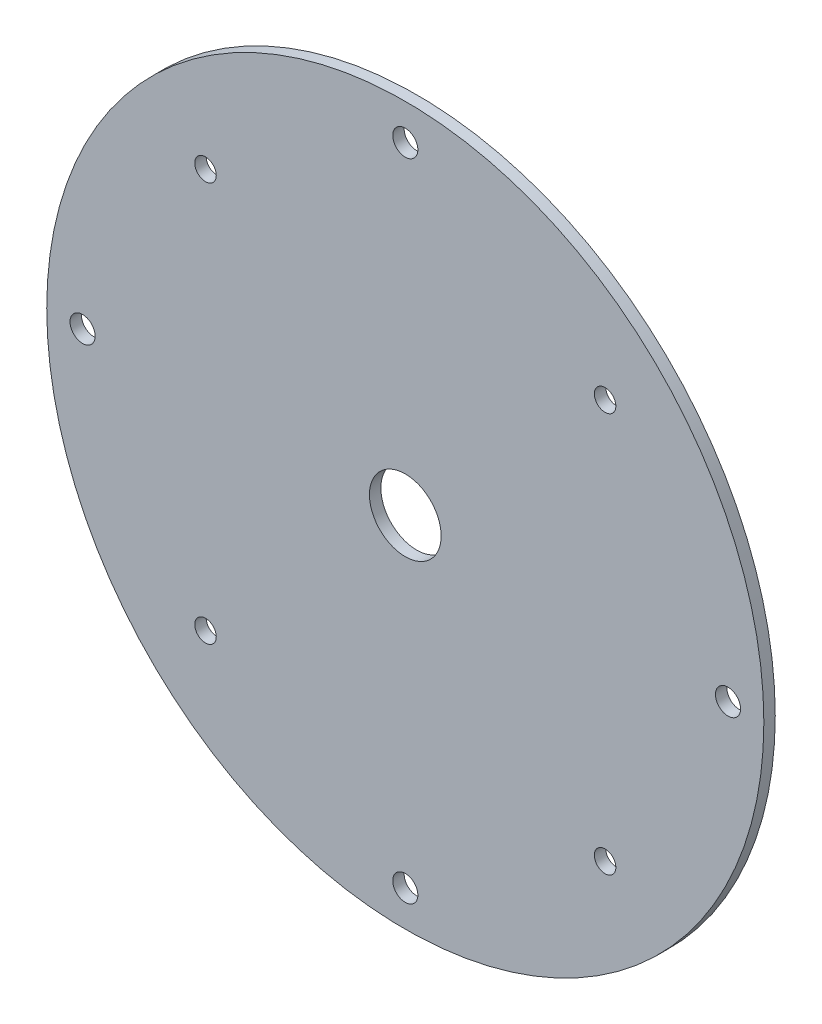
ISO-10303-21;
HEADER;
FILE_DESCRIPTION(('STEP AP214'),'2;1');
FILE_NAME('part.step','',(''),(''),'','','');
FILE_SCHEMA(('AUTOMOTIVE_DESIGN { 1 0 10303 214 1 1 1 1 }'));
ENDSEC;
DATA;
#1=APPLICATION_CONTEXT('core data for automotive mechanical design processes');
#2=APPLICATION_PROTOCOL_DEFINITION('international standard','automotive_design',2000,#1);
#3=PRODUCT_CONTEXT('',#1,'mechanical');
#4=PRODUCT('Part','Part','',(#3));
#5=PRODUCT_RELATED_PRODUCT_CATEGORY('part','',(#4));
#6=PRODUCT_DEFINITION_FORMATION('','',#4);
#7=PRODUCT_DEFINITION_CONTEXT('part definition',#1,'design');
#8=PRODUCT_DEFINITION('design','',#6,#7);
#9=PRODUCT_DEFINITION_SHAPE('','',#8);
#10=(LENGTH_UNIT() NAMED_UNIT(*) SI_UNIT(.MILLI.,.METRE.));
#11=(NAMED_UNIT(*) PLANE_ANGLE_UNIT() SI_UNIT($,.RADIAN.));
#12=(NAMED_UNIT(*) SI_UNIT($,.STERADIAN.) SOLID_ANGLE_UNIT());
#13=UNCERTAINTY_MEASURE_WITH_UNIT(LENGTH_MEASURE(1.E-05),#10,'distance_accuracy_value','');
#14=(GEOMETRIC_REPRESENTATION_CONTEXT(3) GLOBAL_UNCERTAINTY_ASSIGNED_CONTEXT((#13)) GLOBAL_UNIT_ASSIGNED_CONTEXT((#10,
#11,#12)) REPRESENTATION_CONTEXT('',''));
#15=CARTESIAN_POINT('',(0.,0.,0.));
#16=DIRECTION('',(0.,0.,1.));
#17=DIRECTION('',(1.,0.,0.));
#18=AXIS2_PLACEMENT_3D('',#15,#16,#17);
#19=CARTESIAN_POINT('',(0.,0.,1.59));
#20=DIRECTION('',(0.,0.,1.));
#21=DIRECTION('',(1.,0.,0.));
#22=AXIS2_PLACEMENT_3D('',#19,#20,#21);
#23=PLANE('',#22);
#24=CARTESIAN_POINT('',(27.8600143574981,27.8600000000016,1.59));
#25=DIRECTION('',(0.,0.,1.));
#26=DIRECTION('',(1.,0.,0.));
#27=AXIS2_PLACEMENT_3D('',#24,#25,#26);
#28=CIRCLE('',#27,1.5);
#29=CARTESIAN_POINT('',(29.3600143574981,27.8600000000016,1.59));
#30=VERTEX_POINT('',#29);
#31=EDGE_CURVE('E59',#30,#30,#28,.T.);
#32=ORIENTED_EDGE('',*,*,#31,.F.);
#33=EDGE_LOOP('',(#32));
#34=FACE_BOUND('',#33,.T.);
#35=CARTESIAN_POINT('',(27.8600000000016,-27.8600143574965,1.59));
#36=DIRECTION('',(0.,0.,1.));
#37=DIRECTION('',(1.,0.,0.));
#38=AXIS2_PLACEMENT_3D('',#35,#36,#37);
#39=CIRCLE('',#38,1.5);
#40=CARTESIAN_POINT('',(29.3600000000016,-27.8600143574965,1.59));
#41=VERTEX_POINT('',#40);
#42=EDGE_CURVE('E128',#41,#41,#39,.T.);
#43=ORIENTED_EDGE('',*,*,#42,.F.);
#44=EDGE_LOOP('',(#43));
#45=FACE_BOUND('',#44,.T.);
#46=CARTESIAN_POINT('',(-27.8600143574965,-27.86,1.59));
#47=DIRECTION('',(0.,0.,1.));
#48=DIRECTION('',(1.,0.,0.));
#49=AXIS2_PLACEMENT_3D('',#46,#47,#48);
#50=CIRCLE('',#49,1.5);
#51=CARTESIAN_POINT('',(-26.3600143574965,-27.86,1.59));
#52=VERTEX_POINT('',#51);
#53=EDGE_CURVE('E72',#52,#52,#50,.T.);
#54=ORIENTED_EDGE('',*,*,#53,.F.);
#55=EDGE_LOOP('',(#54));
#56=FACE_BOUND('',#55,.T.);
#57=CARTESIAN_POINT('',(-27.86,27.8600143574981,1.59));
#58=DIRECTION('',(0.,0.,1.));
#59=DIRECTION('',(1.,0.,0.));
#60=AXIS2_PLACEMENT_3D('',#57,#58,#59);
#61=CIRCLE('',#60,1.5);
#62=CARTESIAN_POINT('',(-26.36,27.8600143574981,1.59));
#63=VERTEX_POINT('',#62);
#64=EDGE_CURVE('E55',#63,#63,#61,.T.);
#65=ORIENTED_EDGE('',*,*,#64,.F.);
#66=EDGE_LOOP('',(#65));
#67=FACE_BOUND('',#66,.T.);
#68=CARTESIAN_POINT('',(45.0000000000013,1.27346601377202E-12,1.59));
#69=DIRECTION('',(0.,0.,1.));
#70=DIRECTION('',(1.,0.,0.));
#71=AXIS2_PLACEMENT_3D('',#68,#69,#70);
#72=CIRCLE('',#71,1.750000000001);
#73=CARTESIAN_POINT('',(46.7500000000023,1.27346601377202E-12,1.59));
#74=VERTEX_POINT('',#73);
#75=EDGE_CURVE('E78',#74,#74,#72,.T.);
#76=ORIENTED_EDGE('',*,*,#75,.F.);
#77=EDGE_LOOP('',(#76));
#78=FACE_BOUND('',#77,.T.);
#79=CARTESIAN_POINT('',(2.54693202754404E-12,-45.,1.59));
#80=DIRECTION('',(0.,0.,1.));
#81=DIRECTION('',(1.,0.,0.));
#82=AXIS2_PLACEMENT_3D('',#79,#80,#81);
#83=CIRCLE('',#82,1.75000000000274);
#84=CARTESIAN_POINT('',(1.75000000000529,-45.,1.59));
#85=VERTEX_POINT('',#84);
#86=EDGE_CURVE('E84',#85,#85,#83,.T.);
#87=ORIENTED_EDGE('',*,*,#86,.F.);
#88=EDGE_LOOP('',(#87));
#89=FACE_BOUND('',#88,.T.);
#90=CARTESIAN_POINT('',(-44.9999999999987,-1.27897692436818E-12,1.59));
#91=DIRECTION('',(0.,0.,1.));
#92=DIRECTION('',(1.,0.,0.));
#93=AXIS2_PLACEMENT_3D('',#90,#91,#92);
#94=CIRCLE('',#93,1.75000000000205);
#95=CARTESIAN_POINT('',(-43.2499999999967,-1.27897692436818E-12,1.59));
#96=VERTEX_POINT('',#95);
#97=EDGE_CURVE('E54',#96,#96,#94,.T.);
#98=ORIENTED_EDGE('',*,*,#97,.F.);
#99=EDGE_LOOP('',(#98));
#100=FACE_BOUND('',#99,.T.);
#101=CARTESIAN_POINT('',(0.,45.,1.59));
#102=DIRECTION('',(0.,0.,1.));
#103=DIRECTION('',(1.,0.,0.));
#104=AXIS2_PLACEMENT_3D('',#101,#102,#103);
#105=CIRCLE('',#104,1.75);
#106=CARTESIAN_POINT('',(1.75,45.,1.59));
#107=VERTEX_POINT('',#106);
#108=EDGE_CURVE('E77',#107,#107,#105,.T.);
#109=ORIENTED_EDGE('',*,*,#108,.F.);
#110=EDGE_LOOP('',(#109));
#111=FACE_BOUND('',#110,.T.);
#112=CARTESIAN_POINT('',(0.,0.,1.59));
#113=DIRECTION('',(0.,0.,1.));
#114=DIRECTION('',(1.,0.,0.));
#115=AXIS2_PLACEMENT_3D('',#112,#113,#114);
#116=CIRCLE('',#115,50.);
#117=CARTESIAN_POINT('',(-50.,0.,1.59));
#118=VERTEX_POINT('',#117);
#119=EDGE_CURVE('E10',#118,#118,#116,.T.);
#120=ORIENTED_EDGE('',*,*,#119,.T.);
#121=EDGE_LOOP('',(#120));
#122=FACE_BOUND('',#121,.T.);
#123=CARTESIAN_POINT('',(0.,0.,1.59));
#124=DIRECTION('',(0.,0.,1.));
#125=DIRECTION('',(1.,0.,0.));
#126=AXIS2_PLACEMENT_3D('',#123,#124,#125);
#127=CIRCLE('',#126,5.);
#128=CARTESIAN_POINT('',(-5.,0.,1.59));
#129=VERTEX_POINT('',#128);
#130=EDGE_CURVE('E45',#129,#129,#127,.T.);
#131=ORIENTED_EDGE('',*,*,#130,.F.);
#132=EDGE_LOOP('',(#131));
#133=FACE_BOUND('',#132,.T.);
#134=ADVANCED_FACE('F32',(#34,#45,#56,#67,#78,#89,#100,#111,#122,#133),#23,.T.);
#135=CARTESIAN_POINT('',(0.,0.,0.));
#136=DIRECTION('',(0.,0.,1.));
#137=DIRECTION('',(1.,0.,0.));
#138=AXIS2_PLACEMENT_3D('',#135,#136,#137);
#139=PLANE('',#138);
#140=CARTESIAN_POINT('',(27.8600143574981,27.8600000000016,0.));
#141=DIRECTION('',(0.,0.,1.));
#142=DIRECTION('',(1.,0.,0.));
#143=AXIS2_PLACEMENT_3D('',#140,#141,#142);
#144=CIRCLE('',#143,1.5);
#145=CARTESIAN_POINT('',(29.3600143574981,27.8600000000016,0.));
#146=VERTEX_POINT('',#145);
#147=EDGE_CURVE('E36',#146,#146,#144,.T.);
#148=ORIENTED_EDGE('',*,*,#147,.T.);
#149=EDGE_LOOP('',(#148));
#150=FACE_BOUND('',#149,.T.);
#151=CARTESIAN_POINT('',(27.8600000000016,-27.8600143574965,0.));
#152=DIRECTION('',(0.,0.,1.));
#153=DIRECTION('',(1.,0.,0.));
#154=AXIS2_PLACEMENT_3D('',#151,#152,#153);
#155=CIRCLE('',#154,1.5);
#156=CARTESIAN_POINT('',(29.3600000000016,-27.8600143574965,0.));
#157=VERTEX_POINT('',#156);
#158=EDGE_CURVE('E58',#157,#157,#155,.T.);
#159=ORIENTED_EDGE('',*,*,#158,.T.);
#160=EDGE_LOOP('',(#159));
#161=FACE_BOUND('',#160,.T.);
#162=CARTESIAN_POINT('',(-27.8600143574965,-27.86,0.));
#163=DIRECTION('',(0.,0.,1.));
#164=DIRECTION('',(1.,0.,0.));
#165=AXIS2_PLACEMENT_3D('',#162,#163,#164);
#166=CIRCLE('',#165,1.5);
#167=CARTESIAN_POINT('',(-26.3600143574965,-27.86,0.));
#168=VERTEX_POINT('',#167);
#169=EDGE_CURVE('E56',#168,#168,#166,.T.);
#170=ORIENTED_EDGE('',*,*,#169,.T.);
#171=EDGE_LOOP('',(#170));
#172=FACE_BOUND('',#171,.T.);
#173=CARTESIAN_POINT('',(-27.86,27.8600143574981,0.));
#174=DIRECTION('',(0.,0.,1.));
#175=DIRECTION('',(1.,0.,0.));
#176=AXIS2_PLACEMENT_3D('',#173,#174,#175);
#177=CIRCLE('',#176,1.5);
#178=CARTESIAN_POINT('',(-26.36,27.8600143574981,0.));
#179=VERTEX_POINT('',#178);
#180=EDGE_CURVE('E51',#179,#179,#177,.T.);
#181=ORIENTED_EDGE('',*,*,#180,.T.);
#182=EDGE_LOOP('',(#181));
#183=FACE_BOUND('',#182,.T.);
#184=CARTESIAN_POINT('',(45.0000000000013,1.27346601377202E-12,0.));
#185=DIRECTION('',(0.,0.,1.));
#186=DIRECTION('',(1.,0.,0.));
#187=AXIS2_PLACEMENT_3D('',#184,#185,#186);
#188=CIRCLE('',#187,1.750000000001);
#189=CARTESIAN_POINT('',(46.7500000000023,1.27346601377202E-12,0.));
#190=VERTEX_POINT('',#189);
#191=EDGE_CURVE('E74',#190,#190,#188,.T.);
#192=ORIENTED_EDGE('',*,*,#191,.T.);
#193=EDGE_LOOP('',(#192));
#194=FACE_BOUND('',#193,.T.);
#195=CARTESIAN_POINT('',(2.54693202754404E-12,-45.,0.));
#196=DIRECTION('',(0.,0.,1.));
#197=DIRECTION('',(1.,0.,0.));
#198=AXIS2_PLACEMENT_3D('',#195,#196,#197);
#199=CIRCLE('',#198,1.75000000000274);
#200=CARTESIAN_POINT('',(1.75000000000529,-45.,0.));
#201=VERTEX_POINT('',#200);
#202=EDGE_CURVE('E81',#201,#201,#199,.T.);
#203=ORIENTED_EDGE('',*,*,#202,.T.);
#204=EDGE_LOOP('',(#203));
#205=FACE_BOUND('',#204,.T.);
#206=CARTESIAN_POINT('',(-44.9999999999987,-1.27897692436818E-12,0.));
#207=DIRECTION('',(0.,0.,1.));
#208=DIRECTION('',(1.,0.,0.));
#209=AXIS2_PLACEMENT_3D('',#206,#207,#208);
#210=CIRCLE('',#209,1.75000000000205);
#211=CARTESIAN_POINT('',(-43.2499999999967,-1.27897692436818E-12,0.));
#212=VERTEX_POINT('',#211);
#213=EDGE_CURVE('E87',#212,#212,#210,.T.);
#214=ORIENTED_EDGE('',*,*,#213,.T.);
#215=EDGE_LOOP('',(#214));
#216=FACE_BOUND('',#215,.T.);
#217=CARTESIAN_POINT('',(0.,45.,0.));
#218=DIRECTION('',(0.,0.,1.));
#219=DIRECTION('',(1.,0.,0.));
#220=AXIS2_PLACEMENT_3D('',#217,#218,#219);
#221=CIRCLE('',#220,1.75);
#222=CARTESIAN_POINT('',(1.75,45.,0.));
#223=VERTEX_POINT('',#222);
#224=EDGE_CURVE('E92',#223,#223,#221,.T.);
#225=ORIENTED_EDGE('',*,*,#224,.T.);
#226=EDGE_LOOP('',(#225));
#227=FACE_BOUND('',#226,.T.);
#228=CARTESIAN_POINT('',(0.,0.,0.));
#229=DIRECTION('',(0.,0.,1.));
#230=DIRECTION('',(1.,0.,0.));
#231=AXIS2_PLACEMENT_3D('',#228,#229,#230);
#232=CIRCLE('',#231,50.);
#233=CARTESIAN_POINT('',(-50.,0.,0.));
#234=VERTEX_POINT('',#233);
#235=EDGE_CURVE('E40',#234,#234,#232,.T.);
#236=ORIENTED_EDGE('',*,*,#235,.F.);
#237=EDGE_LOOP('',(#236));
#238=FACE_BOUND('',#237,.T.);
#239=CARTESIAN_POINT('',(0.,0.,0.));
#240=DIRECTION('',(0.,0.,1.));
#241=DIRECTION('',(1.,0.,0.));
#242=AXIS2_PLACEMENT_3D('',#239,#240,#241);
#243=CIRCLE('',#242,5.);
#244=CARTESIAN_POINT('',(-5.,0.,0.));
#245=VERTEX_POINT('',#244);
#246=EDGE_CURVE('E48',#245,#245,#243,.T.);
#247=ORIENTED_EDGE('',*,*,#246,.T.);
#248=EDGE_LOOP('',(#247));
#249=FACE_BOUND('',#248,.T.);
#250=ADVANCED_FACE('F102',(#150,#161,#172,#183,#194,#205,#216,#227,#238,#249),#139,.F.);
#251=CARTESIAN_POINT('',(0.,0.,1.59));
#252=DIRECTION('',(0.,0.,-1.));
#253=DIRECTION('',(-1.,0.,0.));
#254=AXIS2_PLACEMENT_3D('',#251,#252,#253);
#255=CYLINDRICAL_SURFACE('',#254,50.);
#256=CARTESIAN_POINT('',(-50.,0.,1.59));
#257=CARTESIAN_POINT('',(-50.,0.,1.5734375));
#258=CARTESIAN_POINT('',(-50.,0.,1.556875));
#259=CARTESIAN_POINT('',(-50.,0.,1.52375));
#260=CARTESIAN_POINT('',(-50.,0.,1.5071875));
#261=CARTESIAN_POINT('',(-50.,0.,1.4740625));
#262=CARTESIAN_POINT('',(-50.,0.,1.4575));
#263=CARTESIAN_POINT('',(-50.,0.,1.424375));
#264=CARTESIAN_POINT('',(-50.,0.,1.4078125));
#265=CARTESIAN_POINT('',(-50.,0.,1.3746875));
#266=CARTESIAN_POINT('',(-50.,0.,1.358125));
#267=CARTESIAN_POINT('',(-50.,0.,1.325));
#268=CARTESIAN_POINT('',(-50.,0.,1.3084375));
#269=CARTESIAN_POINT('',(-50.,0.,1.2753125));
#270=CARTESIAN_POINT('',(-50.,0.,1.25875));
#271=CARTESIAN_POINT('',(-50.,0.,1.225625));
#272=CARTESIAN_POINT('',(-50.,0.,1.2090625));
#273=CARTESIAN_POINT('',(-50.,0.,1.1759375));
#274=CARTESIAN_POINT('',(-50.,0.,1.159375));
#275=CARTESIAN_POINT('',(-50.,0.,1.12625));
#276=CARTESIAN_POINT('',(-50.,0.,1.1096875));
#277=CARTESIAN_POINT('',(-50.,0.,1.0765625));
#278=CARTESIAN_POINT('',(-50.,0.,1.06));
#279=CARTESIAN_POINT('',(-50.,0.,1.026875));
#280=CARTESIAN_POINT('',(-50.,0.,1.0103125));
#281=CARTESIAN_POINT('',(-50.,0.,0.9771875));
#282=CARTESIAN_POINT('',(-50.,0.,0.960625));
#283=CARTESIAN_POINT('',(-50.,0.,0.9275));
#284=CARTESIAN_POINT('',(-50.,0.,0.9109375));
#285=CARTESIAN_POINT('',(-50.,0.,0.8778125));
#286=CARTESIAN_POINT('',(-50.,0.,0.86125));
#287=CARTESIAN_POINT('',(-50.,0.,0.828125));
#288=CARTESIAN_POINT('',(-50.,0.,0.8115625));
#289=CARTESIAN_POINT('',(-50.,0.,0.7784375));
#290=CARTESIAN_POINT('',(-50.,0.,0.761875));
#291=CARTESIAN_POINT('',(-50.,0.,0.72875));
#292=CARTESIAN_POINT('',(-50.,0.,0.7121875));
#293=CARTESIAN_POINT('',(-50.,0.,0.6790625));
#294=CARTESIAN_POINT('',(-50.,0.,0.6625));
#295=CARTESIAN_POINT('',(-50.,0.,0.629375));
#296=CARTESIAN_POINT('',(-50.,0.,0.6128125));
#297=CARTESIAN_POINT('',(-50.,0.,0.5796875));
#298=CARTESIAN_POINT('',(-50.,0.,0.563125));
#299=CARTESIAN_POINT('',(-50.,0.,0.53));
#300=CARTESIAN_POINT('',(-50.,0.,0.5134375));
#301=CARTESIAN_POINT('',(-50.,0.,0.4803125));
#302=CARTESIAN_POINT('',(-50.,0.,0.46375));
#303=CARTESIAN_POINT('',(-50.,0.,0.430625));
#304=CARTESIAN_POINT('',(-50.,0.,0.4140625));
#305=CARTESIAN_POINT('',(-50.,0.,0.3809375));
#306=CARTESIAN_POINT('',(-50.,0.,0.364375));
#307=CARTESIAN_POINT('',(-50.,0.,0.33125));
#308=CARTESIAN_POINT('',(-50.,0.,0.3146875));
#309=CARTESIAN_POINT('',(-50.,0.,0.2815625));
#310=CARTESIAN_POINT('',(-50.,0.,0.265));
#311=CARTESIAN_POINT('',(-50.,0.,0.231875));
#312=CARTESIAN_POINT('',(-50.,0.,0.2153125));
#313=CARTESIAN_POINT('',(-50.,0.,0.1821875));
#314=CARTESIAN_POINT('',(-50.,0.,0.165625));
#315=CARTESIAN_POINT('',(-50.,0.,0.1325));
#316=CARTESIAN_POINT('',(-50.,0.,0.1159375));
#317=CARTESIAN_POINT('',(-50.,0.,0.0828125000000001));
#318=CARTESIAN_POINT('',(-50.,0.,0.06625));
#319=CARTESIAN_POINT('',(-50.,0.,0.033125));
#320=CARTESIAN_POINT('',(-50.,0.,0.0165625));
#321=CARTESIAN_POINT('',(-50.,0.,0.));
#322=B_SPLINE_CURVE_WITH_KNOTS('',3,(#256,#257,#258,#259,#260,#261,#262,#263,#264,#265,#266,
#267,#268,#269,#270,#271,#272,#273,#274,#275,#276,#277,#278,#279,#280,#281,#282,#283,#284,#285,
#286,#287,#288,#289,#290,#291,#292,#293,#294,#295,#296,#297,#298,#299,#300,#301,#302,#303,#304,
#305,#306,#307,#308,#309,#310,#311,#312,#313,#314,#315,#316,#317,#318,#319,#320,#321),
.UNSPECIFIED.,.F.,.F.,(4,2,2,2,2,2,2,2,2,2,2,2,2,2,2,2,2,2,2,2,2,2,2,2,2,2,2,2,2,2,2,2,4),(0.,
0.0496875,0.0993750000000001,0.1490625,0.19875,0.2484375,0.298125,0.3478125,0.3975,0.4471875,
0.496875,0.5465625,0.59625,0.6459375,0.695625,0.7453125,0.795,0.8446875,0.894375,0.9440625,
0.99375,1.0434375,1.093125,1.1428125,1.1925,1.2421875,1.291875,1.3415625,1.39125,1.4409375,
1.490625,1.5403125,1.59),.UNSPECIFIED.);
#323=EDGE_CURVE('BSEAM34',#118,#234,#322,.T.);
#324=ORIENTED_EDGE('',*,*,#119,.F.);
#325=ORIENTED_EDGE('',*,*,#235,.T.);
#326=ORIENTED_EDGE('',*,*,#323,.T.);
#327=ORIENTED_EDGE('',*,*,#323,.F.);
#328=EDGE_LOOP('',(#324,#326,#325,#327));
#329=FACE_BOUND('',#328,.T.);
#330=ADVANCED_FACE('F34',(#329),#255,.T.);
#331=CARTESIAN_POINT('',(0.,0.,1.59));
#332=DIRECTION('',(0.,0.,-1.));
#333=DIRECTION('',(-1.,0.,0.));
#334=AXIS2_PLACEMENT_3D('',#331,#332,#333);
#335=CYLINDRICAL_SURFACE('',#334,5.);
#336=CARTESIAN_POINT('',(-5.,0.,1.59));
#337=CARTESIAN_POINT('',(-5.,0.,1.5734375));
#338=CARTESIAN_POINT('',(-5.,0.,1.556875));
#339=CARTESIAN_POINT('',(-5.,0.,1.52375));
#340=CARTESIAN_POINT('',(-5.,0.,1.5071875));
#341=CARTESIAN_POINT('',(-5.,0.,1.4740625));
#342=CARTESIAN_POINT('',(-5.,0.,1.4575));
#343=CARTESIAN_POINT('',(-5.,0.,1.424375));
#344=CARTESIAN_POINT('',(-5.,0.,1.4078125));
#345=CARTESIAN_POINT('',(-5.,0.,1.3746875));
#346=CARTESIAN_POINT('',(-5.,0.,1.358125));
#347=CARTESIAN_POINT('',(-5.,0.,1.325));
#348=CARTESIAN_POINT('',(-5.,0.,1.3084375));
#349=CARTESIAN_POINT('',(-5.,0.,1.2753125));
#350=CARTESIAN_POINT('',(-5.,0.,1.25875));
#351=CARTESIAN_POINT('',(-5.,0.,1.225625));
#352=CARTESIAN_POINT('',(-5.,0.,1.2090625));
#353=CARTESIAN_POINT('',(-5.,0.,1.1759375));
#354=CARTESIAN_POINT('',(-5.,0.,1.159375));
#355=CARTESIAN_POINT('',(-5.,0.,1.12625));
#356=CARTESIAN_POINT('',(-5.,0.,1.1096875));
#357=CARTESIAN_POINT('',(-5.,0.,1.0765625));
#358=CARTESIAN_POINT('',(-5.,0.,1.06));
#359=CARTESIAN_POINT('',(-5.,0.,1.026875));
#360=CARTESIAN_POINT('',(-5.,0.,1.0103125));
#361=CARTESIAN_POINT('',(-5.,0.,0.9771875));
#362=CARTESIAN_POINT('',(-5.,0.,0.960625));
#363=CARTESIAN_POINT('',(-5.,0.,0.9275));
#364=CARTESIAN_POINT('',(-5.,0.,0.9109375));
#365=CARTESIAN_POINT('',(-5.,0.,0.8778125));
#366=CARTESIAN_POINT('',(-5.,0.,0.86125));
#367=CARTESIAN_POINT('',(-5.,0.,0.828125));
#368=CARTESIAN_POINT('',(-5.,0.,0.8115625));
#369=CARTESIAN_POINT('',(-5.,0.,0.7784375));
#370=CARTESIAN_POINT('',(-5.,0.,0.761875));
#371=CARTESIAN_POINT('',(-5.,0.,0.72875));
#372=CARTESIAN_POINT('',(-5.,0.,0.7121875));
#373=CARTESIAN_POINT('',(-5.,0.,0.6790625));
#374=CARTESIAN_POINT('',(-5.,0.,0.6625));
#375=CARTESIAN_POINT('',(-5.,0.,0.629375));
#376=CARTESIAN_POINT('',(-5.,0.,0.6128125));
#377=CARTESIAN_POINT('',(-5.,0.,0.5796875));
#378=CARTESIAN_POINT('',(-5.,0.,0.563125));
#379=CARTESIAN_POINT('',(-5.,0.,0.53));
#380=CARTESIAN_POINT('',(-5.,0.,0.5134375));
#381=CARTESIAN_POINT('',(-5.,0.,0.4803125));
#382=CARTESIAN_POINT('',(-5.,0.,0.46375));
#383=CARTESIAN_POINT('',(-5.,0.,0.430625));
#384=CARTESIAN_POINT('',(-5.,0.,0.4140625));
#385=CARTESIAN_POINT('',(-5.,0.,0.3809375));
#386=CARTESIAN_POINT('',(-5.,0.,0.364375));
#387=CARTESIAN_POINT('',(-5.,0.,0.33125));
#388=CARTESIAN_POINT('',(-5.,0.,0.3146875));
#389=CARTESIAN_POINT('',(-5.,0.,0.2815625));
#390=CARTESIAN_POINT('',(-5.,0.,0.265));
#391=CARTESIAN_POINT('',(-5.,0.,0.231875));
#392=CARTESIAN_POINT('',(-5.,0.,0.2153125));
#393=CARTESIAN_POINT('',(-5.,0.,0.1821875));
#394=CARTESIAN_POINT('',(-5.,0.,0.165625));
#395=CARTESIAN_POINT('',(-5.,0.,0.1325));
#396=CARTESIAN_POINT('',(-5.,0.,0.1159375));
#397=CARTESIAN_POINT('',(-5.,0.,0.0828125000000001));
#398=CARTESIAN_POINT('',(-5.,0.,0.06625));
#399=CARTESIAN_POINT('',(-5.,0.,0.033125));
#400=CARTESIAN_POINT('',(-5.,0.,0.0165625));
#401=CARTESIAN_POINT('',(-5.,0.,0.));
#402=B_SPLINE_CURVE_WITH_KNOTS('',3,(#336,#337,#338,#339,#340,#341,#342,#343,#344,#345,#346,
#347,#348,#349,#350,#351,#352,#353,#354,#355,#356,#357,#358,#359,#360,#361,#362,#363,#364,#365,
#366,#367,#368,#369,#370,#371,#372,#373,#374,#375,#376,#377,#378,#379,#380,#381,#382,#383,#384,
#385,#386,#387,#388,#389,#390,#391,#392,#393,#394,#395,#396,#397,#398,#399,#400,#401),
.UNSPECIFIED.,.F.,.F.,(4,2,2,2,2,2,2,2,2,2,2,2,2,2,2,2,2,2,2,2,2,2,2,2,2,2,2,2,2,2,2,2,4),(0.,
0.0496875,0.0993750000000001,0.1490625,0.19875,0.2484375,0.298125,0.3478125,0.3975,0.4471875,
0.496875,0.5465625,0.59625,0.6459375,0.695625,0.7453125,0.795,0.8446875,0.894375,0.9440625,
0.99375,1.0434375,1.093125,1.1428125,1.1925,1.2421875,1.291875,1.3415625,1.39125,1.4409375,
1.490625,1.5403125,1.59),.UNSPECIFIED.);
#403=EDGE_CURVE('BSEAM104',#129,#245,#402,.T.);
#404=ORIENTED_EDGE('',*,*,#130,.T.);
#405=ORIENTED_EDGE('',*,*,#246,.F.);
#406=ORIENTED_EDGE('',*,*,#403,.T.);
#407=ORIENTED_EDGE('',*,*,#403,.F.);
#408=EDGE_LOOP('',(#404,#406,#405,#407));
#409=FACE_BOUND('',#408,.T.);
#410=ADVANCED_FACE('F104',(#409),#335,.F.);
#411=CARTESIAN_POINT('',(0.,45.,0.));
#412=DIRECTION('',(0.,0.,1.));
#413=DIRECTION('',(1.,0.,0.));
#414=AXIS2_PLACEMENT_3D('',#411,#412,#413);
#415=CYLINDRICAL_SURFACE('',#414,1.75);
#416=CARTESIAN_POINT('',(1.75,45.,0.));
#417=CARTESIAN_POINT('',(1.75,45.,0.0165625));
#418=CARTESIAN_POINT('',(1.75,45.,0.033125));
#419=CARTESIAN_POINT('',(1.75,45.,0.06625));
#420=CARTESIAN_POINT('',(1.75,45.,0.0828125));
#421=CARTESIAN_POINT('',(1.75,45.,0.1159375));
#422=CARTESIAN_POINT('',(1.75,45.,0.1325));
#423=CARTESIAN_POINT('',(1.75,45.,0.165625));
#424=CARTESIAN_POINT('',(1.75,45.,0.1821875));
#425=CARTESIAN_POINT('',(1.75,45.,0.2153125));
#426=CARTESIAN_POINT('',(1.75,45.,0.231875));
#427=CARTESIAN_POINT('',(1.75,45.,0.265));
#428=CARTESIAN_POINT('',(1.75,45.,0.2815625));
#429=CARTESIAN_POINT('',(1.75,45.,0.3146875));
#430=CARTESIAN_POINT('',(1.75,45.,0.33125));
#431=CARTESIAN_POINT('',(1.75,45.,0.364375));
#432=CARTESIAN_POINT('',(1.75,45.,0.3809375));
#433=CARTESIAN_POINT('',(1.75,45.,0.4140625));
#434=CARTESIAN_POINT('',(1.75,45.,0.430625));
#435=CARTESIAN_POINT('',(1.75,45.,0.46375));
#436=CARTESIAN_POINT('',(1.75,45.,0.4803125));
#437=CARTESIAN_POINT('',(1.75,45.,0.5134375));
#438=CARTESIAN_POINT('',(1.75,45.,0.53));
#439=CARTESIAN_POINT('',(1.75,45.,0.563125));
#440=CARTESIAN_POINT('',(1.75,45.,0.5796875));
#441=CARTESIAN_POINT('',(1.75,45.,0.6128125));
#442=CARTESIAN_POINT('',(1.75,45.,0.629375));
#443=CARTESIAN_POINT('',(1.75,45.,0.6625));
#444=CARTESIAN_POINT('',(1.75,45.,0.6790625));
#445=CARTESIAN_POINT('',(1.75,45.,0.7121875));
#446=CARTESIAN_POINT('',(1.75,45.,0.72875));
#447=CARTESIAN_POINT('',(1.75,45.,0.761875));
#448=CARTESIAN_POINT('',(1.75,45.,0.7784375));
#449=CARTESIAN_POINT('',(1.75,45.,0.8115625));
#450=CARTESIAN_POINT('',(1.75,45.,0.828125));
#451=CARTESIAN_POINT('',(1.75,45.,0.86125));
#452=CARTESIAN_POINT('',(1.75,45.,0.8778125));
#453=CARTESIAN_POINT('',(1.75,45.,0.9109375));
#454=CARTESIAN_POINT('',(1.75,45.,0.9275));
#455=CARTESIAN_POINT('',(1.75,45.,0.960625));
#456=CARTESIAN_POINT('',(1.75,45.,0.9771875));
#457=CARTESIAN_POINT('',(1.75,45.,1.0103125));
#458=CARTESIAN_POINT('',(1.75,45.,1.026875));
#459=CARTESIAN_POINT('',(1.75,45.,1.06));
#460=CARTESIAN_POINT('',(1.75,45.,1.0765625));
#461=CARTESIAN_POINT('',(1.75,45.,1.1096875));
#462=CARTESIAN_POINT('',(1.75,45.,1.12625));
#463=CARTESIAN_POINT('',(1.75,45.,1.159375));
#464=CARTESIAN_POINT('',(1.75,45.,1.1759375));
#465=CARTESIAN_POINT('',(1.75,45.,1.2090625));
#466=CARTESIAN_POINT('',(1.75,45.,1.225625));
#467=CARTESIAN_POINT('',(1.75,45.,1.25875));
#468=CARTESIAN_POINT('',(1.75,45.,1.2753125));
#469=CARTESIAN_POINT('',(1.75,45.,1.3084375));
#470=CARTESIAN_POINT('',(1.75,45.,1.325));
#471=CARTESIAN_POINT('',(1.75,45.,1.358125));
#472=CARTESIAN_POINT('',(1.75,45.,1.3746875));
#473=CARTESIAN_POINT('',(1.75,45.,1.4078125));
#474=CARTESIAN_POINT('',(1.75,45.,1.424375));
#475=CARTESIAN_POINT('',(1.75,45.,1.4575));
#476=CARTESIAN_POINT('',(1.75,45.,1.4740625));
#477=CARTESIAN_POINT('',(1.75,45.,1.5071875));
#478=CARTESIAN_POINT('',(1.75,45.,1.52375));
#479=CARTESIAN_POINT('',(1.75,45.,1.556875));
#480=CARTESIAN_POINT('',(1.75,45.,1.5734375));
#481=CARTESIAN_POINT('',(1.75,45.,1.59));
#482=B_SPLINE_CURVE_WITH_KNOTS('',3,(#416,#417,#418,#419,#420,#421,#422,#423,#424,#425,#426,
#427,#428,#429,#430,#431,#432,#433,#434,#435,#436,#437,#438,#439,#440,#441,#442,#443,#444,#445,
#446,#447,#448,#449,#450,#451,#452,#453,#454,#455,#456,#457,#458,#459,#460,#461,#462,#463,#464,
#465,#466,#467,#468,#469,#470,#471,#472,#473,#474,#475,#476,#477,#478,#479,#480,#481),
.UNSPECIFIED.,.F.,.F.,(4,2,2,2,2,2,2,2,2,2,2,2,2,2,2,2,2,2,2,2,2,2,2,2,2,2,2,2,2,2,2,2,4),(0.,
0.0496875,0.099375,0.1490625,0.19875,0.2484375,0.298125,0.3478125,0.3975,0.4471875,0.496875,
0.5465625,0.59625,0.6459375,0.695625,0.7453125,0.795,0.8446875,0.894375,0.9440625,0.99375,
1.0434375,1.093125,1.1428125,1.1925,1.2421875,1.291875,1.3415625,1.39125,1.4409375,1.490625,
1.5403125,1.59),.UNSPECIFIED.);
#483=EDGE_CURVE('BSEAM106',#223,#107,#482,.T.);
#484=ORIENTED_EDGE('',*,*,#224,.F.);
#485=ORIENTED_EDGE('',*,*,#108,.T.);
#486=ORIENTED_EDGE('',*,*,#483,.T.);
#487=ORIENTED_EDGE('',*,*,#483,.F.);
#488=EDGE_LOOP('',(#484,#486,#485,#487));
#489=FACE_BOUND('',#488,.T.);
#490=ADVANCED_FACE('F106',(#489),#415,.F.);
#491=CARTESIAN_POINT('',(-44.9999999999987,-1.27897692436818E-12,0.));
#492=DIRECTION('',(0.,0.,1.));
#493=DIRECTION('',(1.,0.,0.));
#494=AXIS2_PLACEMENT_3D('',#491,#492,#493);
#495=CYLINDRICAL_SURFACE('',#494,1.75000000000205);
#496=CARTESIAN_POINT('',(-43.2499999999967,-1.27897692436818E-12,0.));
#497=CARTESIAN_POINT('',(-43.2499999999967,-1.27897692436818E-12,0.0165625));
#498=CARTESIAN_POINT('',(-43.2499999999967,-1.27897692436818E-12,0.033125));
#499=CARTESIAN_POINT('',(-43.2499999999967,-1.27897692436818E-12,0.06625));
#500=CARTESIAN_POINT('',(-43.2499999999967,-1.27897692436818E-12,0.0828125));
#501=CARTESIAN_POINT('',(-43.2499999999967,-1.27897692436818E-12,0.1159375));
#502=CARTESIAN_POINT('',(-43.2499999999967,-1.27897692436818E-12,0.1325));
#503=CARTESIAN_POINT('',(-43.2499999999967,-1.27897692436818E-12,0.165625));
#504=CARTESIAN_POINT('',(-43.2499999999967,-1.27897692436818E-12,0.1821875));
#505=CARTESIAN_POINT('',(-43.2499999999967,-1.27897692436818E-12,0.2153125));
#506=CARTESIAN_POINT('',(-43.2499999999967,-1.27897692436818E-12,0.231875));
#507=CARTESIAN_POINT('',(-43.2499999999967,-1.27897692436818E-12,0.265));
#508=CARTESIAN_POINT('',(-43.2499999999967,-1.27897692436818E-12,0.2815625));
#509=CARTESIAN_POINT('',(-43.2499999999967,-1.27897692436818E-12,0.3146875));
#510=CARTESIAN_POINT('',(-43.2499999999967,-1.27897692436818E-12,0.33125));
#511=CARTESIAN_POINT('',(-43.2499999999967,-1.27897692436818E-12,0.364375));
#512=CARTESIAN_POINT('',(-43.2499999999967,-1.27897692436818E-12,0.3809375));
#513=CARTESIAN_POINT('',(-43.2499999999967,-1.27897692436818E-12,0.4140625));
#514=CARTESIAN_POINT('',(-43.2499999999967,-1.27897692436818E-12,0.430625));
#515=CARTESIAN_POINT('',(-43.2499999999967,-1.27897692436818E-12,0.46375));
#516=CARTESIAN_POINT('',(-43.2499999999967,-1.27897692436818E-12,0.4803125));
#517=CARTESIAN_POINT('',(-43.2499999999967,-1.27897692436818E-12,0.5134375));
#518=CARTESIAN_POINT('',(-43.2499999999967,-1.27897692436818E-12,0.53));
#519=CARTESIAN_POINT('',(-43.2499999999967,-1.27897692436818E-12,0.563125));
#520=CARTESIAN_POINT('',(-43.2499999999967,-1.27897692436818E-12,0.5796875));
#521=CARTESIAN_POINT('',(-43.2499999999967,-1.27897692436818E-12,0.6128125));
#522=CARTESIAN_POINT('',(-43.2499999999967,-1.27897692436818E-12,0.629375));
#523=CARTESIAN_POINT('',(-43.2499999999967,-1.27897692436818E-12,0.6625));
#524=CARTESIAN_POINT('',(-43.2499999999967,-1.27897692436818E-12,0.6790625));
#525=CARTESIAN_POINT('',(-43.2499999999967,-1.27897692436818E-12,0.7121875));
#526=CARTESIAN_POINT('',(-43.2499999999967,-1.27897692436818E-12,0.72875));
#527=CARTESIAN_POINT('',(-43.2499999999967,-1.27897692436818E-12,0.761875));
#528=CARTESIAN_POINT('',(-43.2499999999967,-1.27897692436818E-12,0.7784375));
#529=CARTESIAN_POINT('',(-43.2499999999967,-1.27897692436818E-12,0.8115625));
#530=CARTESIAN_POINT('',(-43.2499999999967,-1.27897692436818E-12,0.828125));
#531=CARTESIAN_POINT('',(-43.2499999999967,-1.27897692436818E-12,0.86125));
#532=CARTESIAN_POINT('',(-43.2499999999967,-1.27897692436818E-12,0.8778125));
#533=CARTESIAN_POINT('',(-43.2499999999967,-1.27897692436818E-12,0.9109375));
#534=CARTESIAN_POINT('',(-43.2499999999967,-1.27897692436818E-12,0.9275));
#535=CARTESIAN_POINT('',(-43.2499999999967,-1.27897692436818E-12,0.960625));
#536=CARTESIAN_POINT('',(-43.2499999999967,-1.27897692436818E-12,0.9771875));
#537=CARTESIAN_POINT('',(-43.2499999999967,-1.27897692436818E-12,1.0103125));
#538=CARTESIAN_POINT('',(-43.2499999999967,-1.27897692436818E-12,1.026875));
#539=CARTESIAN_POINT('',(-43.2499999999967,-1.27897692436818E-12,1.06));
#540=CARTESIAN_POINT('',(-43.2499999999967,-1.27897692436818E-12,1.0765625));
#541=CARTESIAN_POINT('',(-43.2499999999967,-1.27897692436818E-12,1.1096875));
#542=CARTESIAN_POINT('',(-43.2499999999967,-1.27897692436818E-12,1.12625));
#543=CARTESIAN_POINT('',(-43.2499999999967,-1.27897692436818E-12,1.159375));
#544=CARTESIAN_POINT('',(-43.2499999999967,-1.27897692436818E-12,1.1759375));
#545=CARTESIAN_POINT('',(-43.2499999999967,-1.27897692436818E-12,1.2090625));
#546=CARTESIAN_POINT('',(-43.2499999999967,-1.27897692436818E-12,1.225625));
#547=CARTESIAN_POINT('',(-43.2499999999967,-1.27897692436818E-12,1.25875));
#548=CARTESIAN_POINT('',(-43.2499999999967,-1.27897692436818E-12,1.2753125));
#549=CARTESIAN_POINT('',(-43.2499999999967,-1.27897692436818E-12,1.3084375));
#550=CARTESIAN_POINT('',(-43.2499999999967,-1.27897692436818E-12,1.325));
#551=CARTESIAN_POINT('',(-43.2499999999967,-1.27897692436818E-12,1.358125));
#552=CARTESIAN_POINT('',(-43.2499999999967,-1.27897692436818E-12,1.3746875));
#553=CARTESIAN_POINT('',(-43.2499999999967,-1.27897692436818E-12,1.4078125));
#554=CARTESIAN_POINT('',(-43.2499999999967,-1.27897692436818E-12,1.424375));
#555=CARTESIAN_POINT('',(-43.2499999999967,-1.27897692436818E-12,1.4575));
#556=CARTESIAN_POINT('',(-43.2499999999967,-1.27897692436818E-12,1.4740625));
#557=CARTESIAN_POINT('',(-43.2499999999967,-1.27897692436818E-12,1.5071875));
#558=CARTESIAN_POINT('',(-43.2499999999967,-1.27897692436818E-12,1.52375));
#559=CARTESIAN_POINT('',(-43.2499999999967,-1.27897692436818E-12,1.556875));
#560=CARTESIAN_POINT('',(-43.2499999999967,-1.27897692436818E-12,1.5734375));
#561=CARTESIAN_POINT('',(-43.2499999999967,-1.27897692436818E-12,1.59));
#562=B_SPLINE_CURVE_WITH_KNOTS('',3,(#496,#497,#498,#499,#500,#501,#502,#503,#504,#505,#506,
#507,#508,#509,#510,#511,#512,#513,#514,#515,#516,#517,#518,#519,#520,#521,#522,#523,#524,#525,
#526,#527,#528,#529,#530,#531,#532,#533,#534,#535,#536,#537,#538,#539,#540,#541,#542,#543,#544,
#545,#546,#547,#548,#549,#550,#551,#552,#553,#554,#555,#556,#557,#558,#559,#560,#561),
.UNSPECIFIED.,.F.,.F.,(4,2,2,2,2,2,2,2,2,2,2,2,2,2,2,2,2,2,2,2,2,2,2,2,2,2,2,2,2,2,2,2,4),(0.,
0.0496875,0.099375,0.1490625,0.19875,0.2484375,0.298125,0.3478125,0.3975,0.4471875,0.496875,
0.5465625,0.59625,0.6459375,0.695625,0.7453125,0.795,0.8446875,0.894375,0.9440625,0.99375,
1.0434375,1.093125,1.1428125,1.1925,1.2421875,1.291875,1.3415625,1.39125,1.4409375,1.490625,
1.5403125,1.59),.UNSPECIFIED.);
#563=EDGE_CURVE('BSEAM112',#212,#96,#562,.T.);
#564=ORIENTED_EDGE('',*,*,#213,.F.);
#565=ORIENTED_EDGE('',*,*,#97,.T.);
#566=ORIENTED_EDGE('',*,*,#563,.T.);
#567=ORIENTED_EDGE('',*,*,#563,.F.);
#568=EDGE_LOOP('',(#564,#566,#565,#567));
#569=FACE_BOUND('',#568,.T.);
#570=ADVANCED_FACE('F112',(#569),#495,.F.);
#571=CARTESIAN_POINT('',(2.54693202754404E-12,-45.,0.));
#572=DIRECTION('',(0.,0.,1.));
#573=DIRECTION('',(1.,0.,0.));
#574=AXIS2_PLACEMENT_3D('',#571,#572,#573);
#575=CYLINDRICAL_SURFACE('',#574,1.75000000000274);
#576=CARTESIAN_POINT('',(1.75000000000529,-45.,0.));
#577=CARTESIAN_POINT('',(1.75000000000529,-45.,0.0165625));
#578=CARTESIAN_POINT('',(1.75000000000529,-45.,0.033125));
#579=CARTESIAN_POINT('',(1.75000000000529,-45.,0.06625));
#580=CARTESIAN_POINT('',(1.75000000000529,-45.,0.0828125));
#581=CARTESIAN_POINT('',(1.75000000000529,-45.,0.1159375));
#582=CARTESIAN_POINT('',(1.75000000000529,-45.,0.1325));
#583=CARTESIAN_POINT('',(1.75000000000529,-45.,0.165625));
#584=CARTESIAN_POINT('',(1.75000000000529,-45.,0.1821875));
#585=CARTESIAN_POINT('',(1.75000000000529,-45.,0.2153125));
#586=CARTESIAN_POINT('',(1.75000000000529,-45.,0.231875));
#587=CARTESIAN_POINT('',(1.75000000000529,-45.,0.265));
#588=CARTESIAN_POINT('',(1.75000000000529,-45.,0.2815625));
#589=CARTESIAN_POINT('',(1.75000000000529,-45.,0.3146875));
#590=CARTESIAN_POINT('',(1.75000000000529,-45.,0.33125));
#591=CARTESIAN_POINT('',(1.75000000000529,-45.,0.364375));
#592=CARTESIAN_POINT('',(1.75000000000529,-45.,0.3809375));
#593=CARTESIAN_POINT('',(1.75000000000529,-45.,0.4140625));
#594=CARTESIAN_POINT('',(1.75000000000529,-45.,0.430625));
#595=CARTESIAN_POINT('',(1.75000000000529,-45.,0.46375));
#596=CARTESIAN_POINT('',(1.75000000000529,-45.,0.4803125));
#597=CARTESIAN_POINT('',(1.75000000000529,-45.,0.5134375));
#598=CARTESIAN_POINT('',(1.75000000000529,-45.,0.53));
#599=CARTESIAN_POINT('',(1.75000000000529,-45.,0.563125));
#600=CARTESIAN_POINT('',(1.75000000000529,-45.,0.5796875));
#601=CARTESIAN_POINT('',(1.75000000000529,-45.,0.6128125));
#602=CARTESIAN_POINT('',(1.75000000000529,-45.,0.629375));
#603=CARTESIAN_POINT('',(1.75000000000529,-45.,0.6625));
#604=CARTESIAN_POINT('',(1.75000000000529,-45.,0.6790625));
#605=CARTESIAN_POINT('',(1.75000000000529,-45.,0.7121875));
#606=CARTESIAN_POINT('',(1.75000000000529,-45.,0.72875));
#607=CARTESIAN_POINT('',(1.75000000000529,-45.,0.761875));
#608=CARTESIAN_POINT('',(1.75000000000529,-45.,0.7784375));
#609=CARTESIAN_POINT('',(1.75000000000529,-45.,0.8115625));
#610=CARTESIAN_POINT('',(1.75000000000529,-45.,0.828125));
#611=CARTESIAN_POINT('',(1.75000000000529,-45.,0.86125));
#612=CARTESIAN_POINT('',(1.75000000000529,-45.,0.8778125));
#613=CARTESIAN_POINT('',(1.75000000000529,-45.,0.9109375));
#614=CARTESIAN_POINT('',(1.75000000000529,-45.,0.9275));
#615=CARTESIAN_POINT('',(1.75000000000529,-45.,0.960625));
#616=CARTESIAN_POINT('',(1.75000000000529,-45.,0.9771875));
#617=CARTESIAN_POINT('',(1.75000000000529,-45.,1.0103125));
#618=CARTESIAN_POINT('',(1.75000000000529,-45.,1.026875));
#619=CARTESIAN_POINT('',(1.75000000000529,-45.,1.06));
#620=CARTESIAN_POINT('',(1.75000000000529,-45.,1.0765625));
#621=CARTESIAN_POINT('',(1.75000000000529,-45.,1.1096875));
#622=CARTESIAN_POINT('',(1.75000000000529,-45.,1.12625));
#623=CARTESIAN_POINT('',(1.75000000000529,-45.,1.159375));
#624=CARTESIAN_POINT('',(1.75000000000529,-45.,1.1759375));
#625=CARTESIAN_POINT('',(1.75000000000529,-45.,1.2090625));
#626=CARTESIAN_POINT('',(1.75000000000529,-45.,1.225625));
#627=CARTESIAN_POINT('',(1.75000000000529,-45.,1.25875));
#628=CARTESIAN_POINT('',(1.75000000000529,-45.,1.2753125));
#629=CARTESIAN_POINT('',(1.75000000000529,-45.,1.3084375));
#630=CARTESIAN_POINT('',(1.75000000000529,-45.,1.325));
#631=CARTESIAN_POINT('',(1.75000000000529,-45.,1.358125));
#632=CARTESIAN_POINT('',(1.75000000000529,-45.,1.3746875));
#633=CARTESIAN_POINT('',(1.75000000000529,-45.,1.4078125));
#634=CARTESIAN_POINT('',(1.75000000000529,-45.,1.424375));
#635=CARTESIAN_POINT('',(1.75000000000529,-45.,1.4575));
#636=CARTESIAN_POINT('',(1.75000000000529,-45.,1.4740625));
#637=CARTESIAN_POINT('',(1.75000000000529,-45.,1.5071875));
#638=CARTESIAN_POINT('',(1.75000000000529,-45.,1.52375));
#639=CARTESIAN_POINT('',(1.75000000000529,-45.,1.556875));
#640=CARTESIAN_POINT('',(1.75000000000529,-45.,1.5734375));
#641=CARTESIAN_POINT('',(1.75000000000529,-45.,1.59));
#642=B_SPLINE_CURVE_WITH_KNOTS('',3,(#576,#577,#578,#579,#580,#581,#582,#583,#584,#585,#586,
#587,#588,#589,#590,#591,#592,#593,#594,#595,#596,#597,#598,#599,#600,#601,#602,#603,#604,#605,
#606,#607,#608,#609,#610,#611,#612,#613,#614,#615,#616,#617,#618,#619,#620,#621,#622,#623,#624,
#625,#626,#627,#628,#629,#630,#631,#632,#633,#634,#635,#636,#637,#638,#639,#640,#641),
.UNSPECIFIED.,.F.,.F.,(4,2,2,2,2,2,2,2,2,2,2,2,2,2,2,2,2,2,2,2,2,2,2,2,2,2,2,2,2,2,2,2,4),(0.,
0.0496875,0.099375,0.1490625,0.19875,0.2484375,0.298125,0.3478125,0.3975,0.4471875,0.496875,
0.5465625,0.59625,0.6459375,0.695625,0.7453125,0.795,0.8446875,0.894375,0.9440625,0.99375,
1.0434375,1.093125,1.1428125,1.1925,1.2421875,1.291875,1.3415625,1.39125,1.4409375,1.490625,
1.5403125,1.59),.UNSPECIFIED.);
#643=EDGE_CURVE('BSEAM144',#201,#85,#642,.T.);
#644=ORIENTED_EDGE('',*,*,#202,.F.);
#645=ORIENTED_EDGE('',*,*,#86,.T.);
#646=ORIENTED_EDGE('',*,*,#643,.T.);
#647=ORIENTED_EDGE('',*,*,#643,.F.);
#648=EDGE_LOOP('',(#644,#646,#645,#647));
#649=FACE_BOUND('',#648,.T.);
#650=ADVANCED_FACE('F144',(#649),#575,.F.);
#651=CARTESIAN_POINT('',(45.0000000000013,1.27346601377202E-12,0.));
#652=DIRECTION('',(0.,0.,1.));
#653=DIRECTION('',(1.,0.,0.));
#654=AXIS2_PLACEMENT_3D('',#651,#652,#653);
#655=CYLINDRICAL_SURFACE('',#654,1.750000000001);
#656=CARTESIAN_POINT('',(46.7500000000023,1.27346601377202E-12,0.));
#657=CARTESIAN_POINT('',(46.7500000000023,1.27346601377202E-12,0.0165625));
#658=CARTESIAN_POINT('',(46.7500000000023,1.27346601377202E-12,0.033125));
#659=CARTESIAN_POINT('',(46.7500000000023,1.27346601377202E-12,0.06625));
#660=CARTESIAN_POINT('',(46.7500000000023,1.27346601377202E-12,0.0828125));
#661=CARTESIAN_POINT('',(46.7500000000023,1.27346601377202E-12,0.1159375));
#662=CARTESIAN_POINT('',(46.7500000000023,1.27346601377202E-12,0.1325));
#663=CARTESIAN_POINT('',(46.7500000000023,1.27346601377202E-12,0.165625));
#664=CARTESIAN_POINT('',(46.7500000000023,1.27346601377202E-12,0.1821875));
#665=CARTESIAN_POINT('',(46.7500000000023,1.27346601377202E-12,0.2153125));
#666=CARTESIAN_POINT('',(46.7500000000023,1.27346601377202E-12,0.231875));
#667=CARTESIAN_POINT('',(46.7500000000023,1.27346601377202E-12,0.265));
#668=CARTESIAN_POINT('',(46.7500000000023,1.27346601377202E-12,0.2815625));
#669=CARTESIAN_POINT('',(46.7500000000023,1.27346601377202E-12,0.3146875));
#670=CARTESIAN_POINT('',(46.7500000000023,1.27346601377202E-12,0.33125));
#671=CARTESIAN_POINT('',(46.7500000000023,1.27346601377202E-12,0.364375));
#672=CARTESIAN_POINT('',(46.7500000000023,1.27346601377202E-12,0.3809375));
#673=CARTESIAN_POINT('',(46.7500000000023,1.27346601377202E-12,0.4140625));
#674=CARTESIAN_POINT('',(46.7500000000023,1.27346601377202E-12,0.430625));
#675=CARTESIAN_POINT('',(46.7500000000023,1.27346601377202E-12,0.46375));
#676=CARTESIAN_POINT('',(46.7500000000023,1.27346601377202E-12,0.4803125));
#677=CARTESIAN_POINT('',(46.7500000000023,1.27346601377202E-12,0.5134375));
#678=CARTESIAN_POINT('',(46.7500000000023,1.27346601377202E-12,0.53));
#679=CARTESIAN_POINT('',(46.7500000000023,1.27346601377202E-12,0.563125));
#680=CARTESIAN_POINT('',(46.7500000000023,1.27346601377202E-12,0.5796875));
#681=CARTESIAN_POINT('',(46.7500000000023,1.27346601377202E-12,0.6128125));
#682=CARTESIAN_POINT('',(46.7500000000023,1.27346601377202E-12,0.629375));
#683=CARTESIAN_POINT('',(46.7500000000023,1.27346601377202E-12,0.6625));
#684=CARTESIAN_POINT('',(46.7500000000023,1.27346601377202E-12,0.6790625));
#685=CARTESIAN_POINT('',(46.7500000000023,1.27346601377202E-12,0.7121875));
#686=CARTESIAN_POINT('',(46.7500000000023,1.27346601377202E-12,0.72875));
#687=CARTESIAN_POINT('',(46.7500000000023,1.27346601377202E-12,0.761875));
#688=CARTESIAN_POINT('',(46.7500000000023,1.27346601377202E-12,0.7784375));
#689=CARTESIAN_POINT('',(46.7500000000023,1.27346601377202E-12,0.8115625));
#690=CARTESIAN_POINT('',(46.7500000000023,1.27346601377202E-12,0.828125));
#691=CARTESIAN_POINT('',(46.7500000000023,1.27346601377202E-12,0.86125));
#692=CARTESIAN_POINT('',(46.7500000000023,1.27346601377202E-12,0.8778125));
#693=CARTESIAN_POINT('',(46.7500000000023,1.27346601377202E-12,0.9109375));
#694=CARTESIAN_POINT('',(46.7500000000023,1.27346601377202E-12,0.9275));
#695=CARTESIAN_POINT('',(46.7500000000023,1.27346601377202E-12,0.960625));
#696=CARTESIAN_POINT('',(46.7500000000023,1.27346601377202E-12,0.9771875));
#697=CARTESIAN_POINT('',(46.7500000000023,1.27346601377202E-12,1.0103125));
#698=CARTESIAN_POINT('',(46.7500000000023,1.27346601377202E-12,1.026875));
#699=CARTESIAN_POINT('',(46.7500000000023,1.27346601377202E-12,1.06));
#700=CARTESIAN_POINT('',(46.7500000000023,1.27346601377202E-12,1.0765625));
#701=CARTESIAN_POINT('',(46.7500000000023,1.27346601377202E-12,1.1096875));
#702=CARTESIAN_POINT('',(46.7500000000023,1.27346601377202E-12,1.12625));
#703=CARTESIAN_POINT('',(46.7500000000023,1.27346601377202E-12,1.159375));
#704=CARTESIAN_POINT('',(46.7500000000023,1.27346601377202E-12,1.1759375));
#705=CARTESIAN_POINT('',(46.7500000000023,1.27346601377202E-12,1.2090625));
#706=CARTESIAN_POINT('',(46.7500000000023,1.27346601377202E-12,1.225625));
#707=CARTESIAN_POINT('',(46.7500000000023,1.27346601377202E-12,1.25875));
#708=CARTESIAN_POINT('',(46.7500000000023,1.27346601377202E-12,1.2753125));
#709=CARTESIAN_POINT('',(46.7500000000023,1.27346601377202E-12,1.3084375));
#710=CARTESIAN_POINT('',(46.7500000000023,1.27346601377202E-12,1.325));
#711=CARTESIAN_POINT('',(46.7500000000023,1.27346601377202E-12,1.358125));
#712=CARTESIAN_POINT('',(46.7500000000023,1.27346601377202E-12,1.3746875));
#713=CARTESIAN_POINT('',(46.7500000000023,1.27346601377202E-12,1.4078125));
#714=CARTESIAN_POINT('',(46.7500000000023,1.27346601377202E-12,1.424375));
#715=CARTESIAN_POINT('',(46.7500000000023,1.27346601377202E-12,1.4575));
#716=CARTESIAN_POINT('',(46.7500000000023,1.27346601377202E-12,1.4740625));
#717=CARTESIAN_POINT('',(46.7500000000023,1.27346601377202E-12,1.5071875));
#718=CARTESIAN_POINT('',(46.7500000000023,1.27346601377202E-12,1.52375));
#719=CARTESIAN_POINT('',(46.7500000000023,1.27346601377202E-12,1.556875));
#720=CARTESIAN_POINT('',(46.7500000000023,1.27346601377202E-12,1.5734375));
#721=CARTESIAN_POINT('',(46.7500000000023,1.27346601377202E-12,1.59));
#722=B_SPLINE_CURVE_WITH_KNOTS('',3,(#656,#657,#658,#659,#660,#661,#662,#663,#664,#665,#666,
#667,#668,#669,#670,#671,#672,#673,#674,#675,#676,#677,#678,#679,#680,#681,#682,#683,#684,#685,
#686,#687,#688,#689,#690,#691,#692,#693,#694,#695,#696,#697,#698,#699,#700,#701,#702,#703,#704,
#705,#706,#707,#708,#709,#710,#711,#712,#713,#714,#715,#716,#717,#718,#719,#720,#721),
.UNSPECIFIED.,.F.,.F.,(4,2,2,2,2,2,2,2,2,2,2,2,2,2,2,2,2,2,2,2,2,2,2,2,2,2,2,2,2,2,2,2,4),(0.,
0.0496875,0.099375,0.1490625,0.19875,0.2484375,0.298125,0.3478125,0.3975,0.4471875,0.496875,
0.5465625,0.59625,0.6459375,0.695625,0.7453125,0.795,0.8446875,0.894375,0.9440625,0.99375,
1.0434375,1.093125,1.1428125,1.1925,1.2421875,1.291875,1.3415625,1.39125,1.4409375,1.490625,
1.5403125,1.59),.UNSPECIFIED.);
#723=EDGE_CURVE('BSEAM150',#190,#74,#722,.T.);
#724=ORIENTED_EDGE('',*,*,#191,.F.);
#725=ORIENTED_EDGE('',*,*,#75,.T.);
#726=ORIENTED_EDGE('',*,*,#723,.T.);
#727=ORIENTED_EDGE('',*,*,#723,.F.);
#728=EDGE_LOOP('',(#724,#726,#725,#727));
#729=FACE_BOUND('',#728,.T.);
#730=ADVANCED_FACE('F150',(#729),#655,.F.);
#731=CARTESIAN_POINT('',(-27.86,27.8600143574981,-8.41));
#732=DIRECTION('',(0.,0.,1.));
#733=DIRECTION('',(1.,0.,0.));
#734=AXIS2_PLACEMENT_3D('',#731,#732,#733);
#735=CYLINDRICAL_SURFACE('',#734,1.5);
#736=ORIENTED_EDGE('',*,*,#64,.T.);
#737=EDGE_LOOP('',(#736));
#738=FACE_BOUND('',#737,.T.);
#739=ORIENTED_EDGE('',*,*,#180,.F.);
#740=EDGE_LOOP('',(#739));
#741=FACE_BOUND('',#740,.T.);
#742=ADVANCED_FACE('F157',(#738,#741),#735,.F.);
#743=CARTESIAN_POINT('',(-27.8600143574965,-27.86,-8.41));
#744=DIRECTION('',(0.,0.,1.));
#745=DIRECTION('',(1.,0.,0.));
#746=AXIS2_PLACEMENT_3D('',#743,#744,#745);
#747=CYLINDRICAL_SURFACE('',#746,1.5);
#748=ORIENTED_EDGE('',*,*,#53,.T.);
#749=EDGE_LOOP('',(#748));
#750=FACE_BOUND('',#749,.T.);
#751=ORIENTED_EDGE('',*,*,#169,.F.);
#752=EDGE_LOOP('',(#751));
#753=FACE_BOUND('',#752,.T.);
#754=ADVANCED_FACE('F161',(#750,#753),#747,.F.);
#755=CARTESIAN_POINT('',(27.8600000000016,-27.8600143574965,-8.41));
#756=DIRECTION('',(0.,0.,1.));
#757=DIRECTION('',(1.,0.,0.));
#758=AXIS2_PLACEMENT_3D('',#755,#756,#757);
#759=CYLINDRICAL_SURFACE('',#758,1.5);
#760=ORIENTED_EDGE('',*,*,#42,.T.);
#761=EDGE_LOOP('',(#760));
#762=FACE_BOUND('',#761,.T.);
#763=ORIENTED_EDGE('',*,*,#158,.F.);
#764=EDGE_LOOP('',(#763));
#765=FACE_BOUND('',#764,.T.);
#766=ADVANCED_FACE('F164',(#762,#765),#759,.F.);
#767=CARTESIAN_POINT('',(27.8600143574981,27.8600000000016,-8.41));
#768=DIRECTION('',(0.,0.,1.));
#769=DIRECTION('',(1.,0.,0.));
#770=AXIS2_PLACEMENT_3D('',#767,#768,#769);
#771=CYLINDRICAL_SURFACE('',#770,1.5);
#772=ORIENTED_EDGE('',*,*,#31,.T.);
#773=EDGE_LOOP('',(#772));
#774=FACE_BOUND('',#773,.T.);
#775=ORIENTED_EDGE('',*,*,#147,.F.);
#776=EDGE_LOOP('',(#775));
#777=FACE_BOUND('',#776,.T.);
#778=ADVANCED_FACE('F168',(#774,#777),#771,.F.);
#779=CLOSED_SHELL('',(#134,#250,#330,#410,#490,#570,#650,#730,#742,#754,#766,#778));
#780=MANIFOLD_SOLID_BREP('B2',#779);
#781=ADVANCED_BREP_SHAPE_REPRESENTATION('',(#18,#780),#14);
#782=SHAPE_DEFINITION_REPRESENTATION(#9,#781);
ENDSEC;
END-ISO-10303-21;
